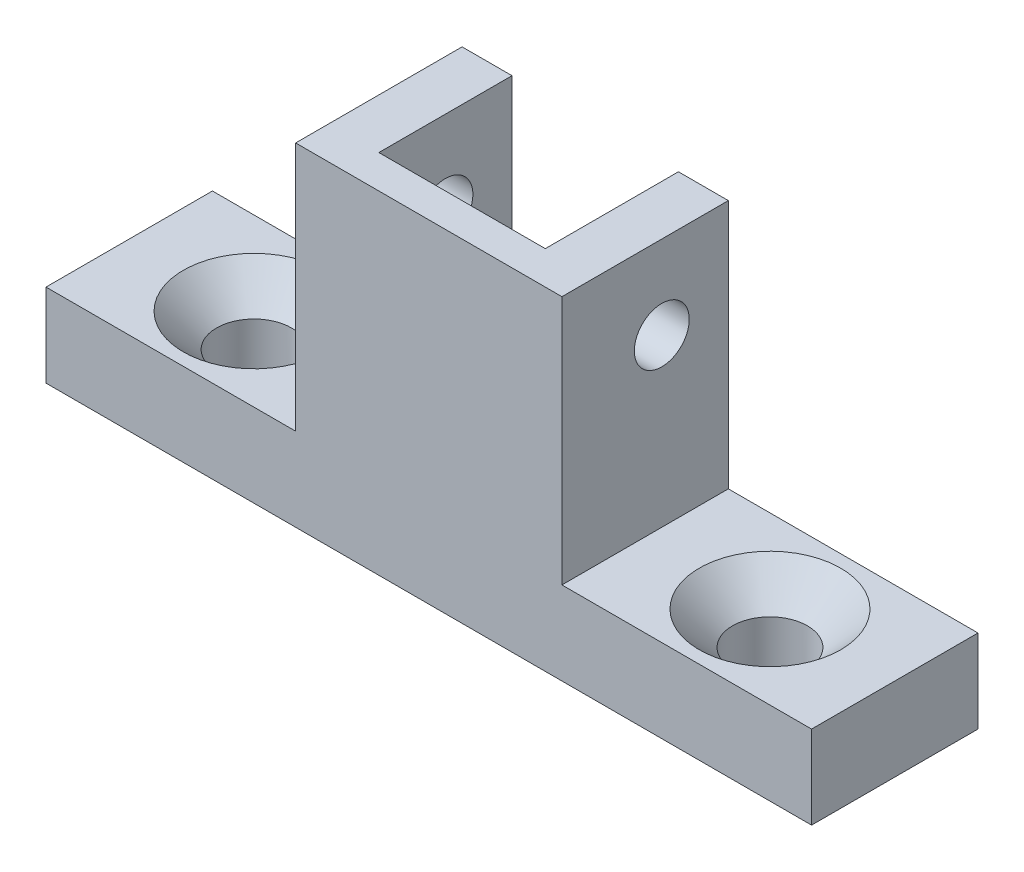
ISO-10303-21;
HEADER;
FILE_DESCRIPTION(('STEP AP214'),'2;1');
FILE_NAME('part.step','',(''),(''),'','','');
FILE_SCHEMA(('AUTOMOTIVE_DESIGN { 1 0 10303 214 1 1 1 1 }'));
ENDSEC;
DATA;
#1=APPLICATION_CONTEXT('core data for automotive mechanical design processes');
#2=APPLICATION_PROTOCOL_DEFINITION('international standard','automotive_design',2000,#1);
#3=PRODUCT_CONTEXT('',#1,'mechanical');
#4=PRODUCT('Part','Part','',(#3));
#5=PRODUCT_RELATED_PRODUCT_CATEGORY('part','',(#4));
#6=PRODUCT_DEFINITION_FORMATION('','',#4);
#7=PRODUCT_DEFINITION_CONTEXT('part definition',#1,'design');
#8=PRODUCT_DEFINITION('design','',#6,#7);
#9=PRODUCT_DEFINITION_SHAPE('','',#8);
#10=(LENGTH_UNIT() NAMED_UNIT(*) SI_UNIT(.MILLI.,.METRE.));
#11=(NAMED_UNIT(*) PLANE_ANGLE_UNIT() SI_UNIT($,.RADIAN.));
#12=(NAMED_UNIT(*) SI_UNIT($,.STERADIAN.) SOLID_ANGLE_UNIT());
#13=UNCERTAINTY_MEASURE_WITH_UNIT(LENGTH_MEASURE(1.E-05),#10,'distance_accuracy_value','');
#14=(GEOMETRIC_REPRESENTATION_CONTEXT(3) GLOBAL_UNCERTAINTY_ASSIGNED_CONTEXT((#13)) GLOBAL_UNIT_ASSIGNED_CONTEXT((#10,
#11,#12)) REPRESENTATION_CONTEXT('',''));
#15=CARTESIAN_POINT('',(0.,0.,0.));
#16=DIRECTION('',(0.,0.,1.));
#17=DIRECTION('',(1.,0.,0.));
#18=AXIS2_PLACEMENT_3D('',#15,#16,#17);
#19=CARTESIAN_POINT('',(23.,-15.,5.));
#20=DIRECTION('',(-1.,0.,0.));
#21=DIRECTION('',(0.,-1.,0.));
#22=AXIS2_PLACEMENT_3D('',#19,#20,#21);
#23=PLANE('',#22);
#24=DIRECTION('',(0.,1.,0.));
#25=VECTOR('',#24,1.);
#26=CARTESIAN_POINT('',(23.,-15.,-5.));
#27=LINE('',#26,#25);
#28=CARTESIAN_POINT('',(23.,-15.,-5.));
#29=VERTEX_POINT('',#28);
#30=CARTESIAN_POINT('',(23.,-10.,-5.));
#31=VERTEX_POINT('',#30);
#32=EDGE_CURVE('E154',#29,#31,#27,.T.);
#33=ORIENTED_EDGE('',*,*,#32,.T.);
#34=DIRECTION('',(0.,0.,-1.));
#35=VECTOR('',#34,1.);
#36=CARTESIAN_POINT('',(23.,-10.,5.));
#37=LINE('',#36,#35);
#38=CARTESIAN_POINT('',(23.,-10.,5.));
#39=VERTEX_POINT('',#38);
#40=EDGE_CURVE('E199',#39,#31,#37,.T.);
#41=ORIENTED_EDGE('',*,*,#40,.F.);
#42=DIRECTION('',(0.,1.,0.));
#43=VECTOR('',#42,1.);
#44=CARTESIAN_POINT('',(23.,-15.,5.));
#45=LINE('',#44,#43);
#46=CARTESIAN_POINT('',(23.,-15.,5.));
#47=VERTEX_POINT('',#46);
#48=EDGE_CURVE('E180',#47,#39,#45,.T.);
#49=ORIENTED_EDGE('',*,*,#48,.F.);
#50=DIRECTION('',(0.,0.,-1.));
#51=VECTOR('',#50,1.);
#52=CARTESIAN_POINT('',(23.,-15.,5.));
#53=LINE('',#52,#51);
#54=EDGE_CURVE('E150',#47,#29,#53,.T.);
#55=ORIENTED_EDGE('',*,*,#54,.T.);
#56=EDGE_LOOP('',(#33,#41,#49,#55));
#57=FACE_BOUND('',#56,.T.);
#58=ADVANCED_FACE('F38',(#57),#23,.F.);
#59=CARTESIAN_POINT('',(23.,-10.,5.));
#60=DIRECTION('',(0.,-1.,0.));
#61=DIRECTION('',(1.,0.,0.));
#62=AXIS2_PLACEMENT_3D('',#59,#60,#61);
#63=PLANE('',#62);
#64=CARTESIAN_POINT('',(15.5,-10.,0.));
#65=DIRECTION('',(0.,-1.,0.));
#66=DIRECTION('',(1.,0.,0.));
#67=AXIS2_PLACEMENT_3D('',#64,#65,#66);
#68=CIRCLE('',#67,4.24999999999999);
#69=CARTESIAN_POINT('',(19.75,-10.,0.));
#70=VERTEX_POINT('',#69);
#71=EDGE_CURVE('E206',#70,#70,#68,.T.);
#72=ORIENTED_EDGE('',*,*,#71,.T.);
#73=EDGE_LOOP('',(#72));
#74=FACE_BOUND('',#73,.T.);
#75=DIRECTION('',(-1.,0.,0.));
#76=VECTOR('',#75,1.);
#77=CARTESIAN_POINT('',(23.,-10.,-5.));
#78=LINE('',#77,#76);
#79=CARTESIAN_POINT('',(8.,-10.,-5.));
#80=VERTEX_POINT('',#79);
#81=EDGE_CURVE('E158',#31,#80,#78,.T.);
#82=ORIENTED_EDGE('',*,*,#81,.T.);
#83=DIRECTION('',(0.,0.,-1.));
#84=VECTOR('',#83,1.);
#85=CARTESIAN_POINT('',(8.,-10.,5.));
#86=LINE('',#85,#84);
#87=CARTESIAN_POINT('',(8.,-10.,5.));
#88=VERTEX_POINT('',#87);
#89=EDGE_CURVE('E195',#88,#80,#86,.T.);
#90=ORIENTED_EDGE('',*,*,#89,.F.);
#91=DIRECTION('',(-1.,0.,0.));
#92=VECTOR('',#91,1.);
#93=CARTESIAN_POINT('',(23.,-10.,5.));
#94=LINE('',#93,#92);
#95=EDGE_CURVE('E106',#39,#88,#94,.T.);
#96=ORIENTED_EDGE('',*,*,#95,.F.);
#97=ORIENTED_EDGE('',*,*,#40,.T.);
#98=EDGE_LOOP('',(#82,#90,#96,#97));
#99=FACE_BOUND('',#98,.T.);
#100=ADVANCED_FACE('F231',(#74,#99),#63,.F.);
#101=CARTESIAN_POINT('',(8.,-10.,5.));
#102=DIRECTION('',(-1.,0.,0.));
#103=DIRECTION('',(0.,-1.,0.));
#104=AXIS2_PLACEMENT_3D('',#101,#102,#103);
#105=PLANE('',#104);
#106=CARTESIAN_POINT('',(8.,0.,-0.999999999999999));
#107=DIRECTION('',(1.,0.,0.));
#108=DIRECTION('',(0.,1.,0.));
#109=AXIS2_PLACEMENT_3D('',#106,#107,#108);
#110=CIRCLE('',#109,1.65);
#111=CARTESIAN_POINT('',(8.,1.65,-0.999999999999999));
#112=VERTEX_POINT('',#111);
#113=EDGE_CURVE('E401',#112,#112,#110,.T.);
#114=ORIENTED_EDGE('',*,*,#113,.F.);
#115=EDGE_LOOP('',(#114));
#116=FACE_BOUND('',#115,.T.);
#117=DIRECTION('',(0.,1.,0.));
#118=VECTOR('',#117,1.);
#119=CARTESIAN_POINT('',(8.,-10.,-5.));
#120=LINE('',#119,#118);
#121=CARTESIAN_POINT('',(8.,5.,-5.));
#122=VERTEX_POINT('',#121);
#123=EDGE_CURVE('E162',#80,#122,#120,.T.);
#124=ORIENTED_EDGE('',*,*,#123,.T.);
#125=DIRECTION('',(0.,0.,-1.));
#126=VECTOR('',#125,1.);
#127=CARTESIAN_POINT('',(8.,5.,5.));
#128=LINE('',#127,#126);
#129=CARTESIAN_POINT('',(8.,5.,5.));
#130=VERTEX_POINT('',#129);
#131=EDGE_CURVE('E191',#130,#122,#128,.T.);
#132=ORIENTED_EDGE('',*,*,#131,.F.);
#133=DIRECTION('',(0.,1.,0.));
#134=VECTOR('',#133,1.);
#135=CARTESIAN_POINT('',(8.,-10.,5.));
#136=LINE('',#135,#134);
#137=EDGE_CURVE('E357',#88,#130,#136,.T.);
#138=ORIENTED_EDGE('',*,*,#137,.F.);
#139=ORIENTED_EDGE('',*,*,#89,.T.);
#140=EDGE_LOOP('',(#124,#132,#138,#139));
#141=FACE_BOUND('',#140,.T.);
#142=ADVANCED_FACE('F238',(#116,#141),#105,.F.);
#143=CARTESIAN_POINT('',(8.,5.,5.));
#144=DIRECTION('',(0.,-1.,0.));
#145=DIRECTION('',(0.,0.,-1.));
#146=AXIS2_PLACEMENT_3D('',#143,#144,#145);
#147=PLANE('',#146);
#148=DIRECTION('',(1.,0.,0.));
#149=VECTOR('',#148,1.);
#150=CARTESIAN_POINT('',(5.,5.,3.));
#151=LINE('',#150,#149);
#152=CARTESIAN_POINT('',(-5.,5.,3.));
#153=VERTEX_POINT('',#152);
#154=CARTESIAN_POINT('',(5.,5.,3.));
#155=VERTEX_POINT('',#154);
#156=EDGE_CURVE('E309',#153,#155,#151,.T.);
#157=ORIENTED_EDGE('',*,*,#156,.F.);
#158=DIRECTION('',(0.,0.,1.));
#159=VECTOR('',#158,1.);
#160=CARTESIAN_POINT('',(-5.,5.,-5.));
#161=LINE('',#160,#159);
#162=CARTESIAN_POINT('',(-5.,5.,-5.));
#163=VERTEX_POINT('',#162);
#164=EDGE_CURVE('E304',#163,#153,#161,.T.);
#165=ORIENTED_EDGE('',*,*,#164,.F.);
#166=DIRECTION('',(-1.,0.,0.));
#167=VECTOR('',#166,1.);
#168=CARTESIAN_POINT('',(8.,5.,-5.));
#169=LINE('',#168,#167);
#170=CARTESIAN_POINT('',(-8.,5.,-5.));
#171=VERTEX_POINT('',#170);
#172=EDGE_CURVE('E165',#163,#171,#169,.T.);
#173=ORIENTED_EDGE('',*,*,#172,.T.);
#174=DIRECTION('',(0.,0.,-1.));
#175=VECTOR('',#174,1.);
#176=CARTESIAN_POINT('',(-8.,5.,5.));
#177=LINE('',#176,#175);
#178=CARTESIAN_POINT('',(-8.,5.,5.));
#179=VERTEX_POINT('',#178);
#180=EDGE_CURVE('E187',#179,#171,#177,.T.);
#181=ORIENTED_EDGE('',*,*,#180,.F.);
#182=DIRECTION('',(-1.,0.,0.));
#183=VECTOR('',#182,1.);
#184=CARTESIAN_POINT('',(8.,5.,5.));
#185=LINE('',#184,#183);
#186=EDGE_CURVE('E360',#130,#179,#185,.T.);
#187=ORIENTED_EDGE('',*,*,#186,.F.);
#188=ORIENTED_EDGE('',*,*,#131,.T.);
#189=CARTESIAN_POINT('',(5.,5.,-5.));
#190=VERTEX_POINT('',#189);
#191=EDGE_CURVE('E166',#122,#190,#169,.T.);
#192=ORIENTED_EDGE('',*,*,#191,.T.);
#193=DIRECTION('',(0.,0.,-1.));
#194=VECTOR('',#193,1.);
#195=CARTESIAN_POINT('',(5.,5.,-5.));
#196=LINE('',#195,#194);
#197=EDGE_CURVE('E55',#155,#190,#196,.T.);
#198=ORIENTED_EDGE('',*,*,#197,.F.);
#199=EDGE_LOOP('',(#157,#165,#173,#181,#187,#188,#192,#198));
#200=FACE_BOUND('',#199,.T.);
#201=ADVANCED_FACE('F244',(#200),#147,.F.);
#202=CARTESIAN_POINT('',(-8.,5.,5.));
#203=DIRECTION('',(1.,0.,0.));
#204=DIRECTION('',(0.,1.,0.));
#205=AXIS2_PLACEMENT_3D('',#202,#203,#204);
#206=PLANE('',#205);
#207=CARTESIAN_POINT('',(-8.,0.,-0.999999999999999));
#208=DIRECTION('',(1.,0.,0.));
#209=DIRECTION('',(0.,1.,0.));
#210=AXIS2_PLACEMENT_3D('',#207,#208,#209);
#211=CIRCLE('',#210,1.65);
#212=CARTESIAN_POINT('',(-8.,1.65,-0.999999999999999));
#213=VERTEX_POINT('',#212);
#214=EDGE_CURVE('E299',#213,#213,#211,.T.);
#215=ORIENTED_EDGE('',*,*,#214,.T.);
#216=EDGE_LOOP('',(#215));
#217=FACE_BOUND('',#216,.T.);
#218=DIRECTION('',(0.,-1.,0.));
#219=VECTOR('',#218,1.);
#220=CARTESIAN_POINT('',(-8.,5.,-5.));
#221=LINE('',#220,#219);
#222=CARTESIAN_POINT('',(-8.,-10.,-5.));
#223=VERTEX_POINT('',#222);
#224=EDGE_CURVE('E170',#171,#223,#221,.T.);
#225=ORIENTED_EDGE('',*,*,#224,.T.);
#226=DIRECTION('',(0.,0.,-1.));
#227=VECTOR('',#226,1.);
#228=CARTESIAN_POINT('',(-8.,-10.,5.));
#229=LINE('',#228,#227);
#230=CARTESIAN_POINT('',(-8.,-10.,5.));
#231=VERTEX_POINT('',#230);
#232=EDGE_CURVE('E143',#231,#223,#229,.T.);
#233=ORIENTED_EDGE('',*,*,#232,.F.);
#234=DIRECTION('',(0.,-1.,0.));
#235=VECTOR('',#234,1.);
#236=CARTESIAN_POINT('',(-8.,5.,5.));
#237=LINE('',#236,#235);
#238=EDGE_CURVE('E129',#179,#231,#237,.T.);
#239=ORIENTED_EDGE('',*,*,#238,.F.);
#240=ORIENTED_EDGE('',*,*,#180,.T.);
#241=EDGE_LOOP('',(#225,#233,#239,#240));
#242=FACE_BOUND('',#241,.T.);
#243=ADVANCED_FACE('F248',(#217,#242),#206,.F.);
#244=CARTESIAN_POINT('',(-8.,-10.,5.));
#245=DIRECTION('',(0.,-1.,0.));
#246=DIRECTION('',(1.,0.,0.));
#247=AXIS2_PLACEMENT_3D('',#244,#245,#246);
#248=PLANE('',#247);
#249=CARTESIAN_POINT('',(-15.5,-10.,0.));
#250=DIRECTION('',(0.,-1.,0.));
#251=DIRECTION('',(1.,0.,0.));
#252=AXIS2_PLACEMENT_3D('',#249,#250,#251);
#253=CIRCLE('',#252,4.25);
#254=CARTESIAN_POINT('',(-11.25,-10.,0.));
#255=VERTEX_POINT('',#254);
#256=EDGE_CURVE('E11',#255,#255,#253,.T.);
#257=ORIENTED_EDGE('',*,*,#256,.T.);
#258=EDGE_LOOP('',(#257));
#259=FACE_BOUND('',#258,.T.);
#260=DIRECTION('',(-1.,0.,0.));
#261=VECTOR('',#260,1.);
#262=CARTESIAN_POINT('',(-8.,-10.,-5.));
#263=LINE('',#262,#261);
#264=CARTESIAN_POINT('',(-23.,-10.,-5.));
#265=VERTEX_POINT('',#264);
#266=EDGE_CURVE('E139',#223,#265,#263,.T.);
#267=ORIENTED_EDGE('',*,*,#266,.T.);
#268=DIRECTION('',(0.,0.,-1.));
#269=VECTOR('',#268,1.);
#270=CARTESIAN_POINT('',(-23.,-10.,5.));
#271=LINE('',#270,#269);
#272=CARTESIAN_POINT('',(-23.,-10.,5.));
#273=VERTEX_POINT('',#272);
#274=EDGE_CURVE('E136',#273,#265,#271,.T.);
#275=ORIENTED_EDGE('',*,*,#274,.F.);
#276=DIRECTION('',(-1.,0.,0.));
#277=VECTOR('',#276,1.);
#278=CARTESIAN_POINT('',(-8.,-10.,5.));
#279=LINE('',#278,#277);
#280=EDGE_CURVE('E122',#231,#273,#279,.T.);
#281=ORIENTED_EDGE('',*,*,#280,.F.);
#282=ORIENTED_EDGE('',*,*,#232,.T.);
#283=EDGE_LOOP('',(#267,#275,#281,#282));
#284=FACE_BOUND('',#283,.T.);
#285=ADVANCED_FACE('F137',(#259,#284),#248,.F.);
#286=CARTESIAN_POINT('',(-23.,-10.,5.));
#287=DIRECTION('',(1.,0.,0.));
#288=DIRECTION('',(0.,1.,0.));
#289=AXIS2_PLACEMENT_3D('',#286,#287,#288);
#290=PLANE('',#289);
#291=DIRECTION('',(0.,-1.,0.));
#292=VECTOR('',#291,1.);
#293=CARTESIAN_POINT('',(-23.,-10.,-5.));
#294=LINE('',#293,#292);
#295=CARTESIAN_POINT('',(-23.,-15.,-5.));
#296=VERTEX_POINT('',#295);
#297=EDGE_CURVE('E175',#265,#296,#294,.T.);
#298=ORIENTED_EDGE('',*,*,#297,.T.);
#299=DIRECTION('',(0.,0.,-1.));
#300=VECTOR('',#299,1.);
#301=CARTESIAN_POINT('',(-23.,-15.,5.));
#302=LINE('',#301,#300);
#303=CARTESIAN_POINT('',(-23.,-15.,5.));
#304=VERTEX_POINT('',#303);
#305=EDGE_CURVE('E144',#304,#296,#302,.T.);
#306=ORIENTED_EDGE('',*,*,#305,.F.);
#307=DIRECTION('',(0.,-1.,0.));
#308=VECTOR('',#307,1.);
#309=CARTESIAN_POINT('',(-23.,-10.,5.));
#310=LINE('',#309,#308);
#311=EDGE_CURVE('E126',#273,#304,#310,.T.);
#312=ORIENTED_EDGE('',*,*,#311,.F.);
#313=ORIENTED_EDGE('',*,*,#274,.T.);
#314=EDGE_LOOP('',(#298,#306,#312,#313));
#315=FACE_BOUND('',#314,.T.);
#316=ADVANCED_FACE('F146',(#315),#290,.F.);
#317=CARTESIAN_POINT('',(-23.,-15.,5.));
#318=DIRECTION('',(0.,1.,0.));
#319=DIRECTION('',(0.,0.,1.));
#320=AXIS2_PLACEMENT_3D('',#317,#318,#319);
#321=PLANE('',#320);
#322=CARTESIAN_POINT('',(-15.5,-15.,0.));
#323=DIRECTION('',(0.,1.,0.));
#324=DIRECTION('',(-1.,0.,0.));
#325=AXIS2_PLACEMENT_3D('',#322,#323,#324);
#326=CIRCLE('',#325,2.25);
#327=CARTESIAN_POINT('',(-17.75,-15.,0.));
#328=VERTEX_POINT('',#327);
#329=EDGE_CURVE('E159',#328,#328,#326,.T.);
#330=ORIENTED_EDGE('',*,*,#329,.T.);
#331=EDGE_LOOP('',(#330));
#332=FACE_BOUND('',#331,.T.);
#333=CARTESIAN_POINT('',(15.5,-15.,0.));
#334=DIRECTION('',(0.,1.,0.));
#335=DIRECTION('',(-1.,0.,0.));
#336=AXIS2_PLACEMENT_3D('',#333,#334,#335);
#337=CIRCLE('',#336,2.25);
#338=CARTESIAN_POINT('',(13.25,-15.,0.));
#339=VERTEX_POINT('',#338);
#340=EDGE_CURVE('E346',#339,#339,#337,.T.);
#341=ORIENTED_EDGE('',*,*,#340,.T.);
#342=EDGE_LOOP('',(#341));
#343=FACE_BOUND('',#342,.T.);
#344=DIRECTION('',(1.,0.,0.));
#345=VECTOR('',#344,1.);
#346=CARTESIAN_POINT('',(-23.,-15.,-5.));
#347=LINE('',#346,#345);
#348=EDGE_CURVE('E97',#296,#29,#347,.T.);
#349=ORIENTED_EDGE('',*,*,#348,.T.);
#350=ORIENTED_EDGE('',*,*,#54,.F.);
#351=DIRECTION('',(1.,0.,0.));
#352=VECTOR('',#351,1.);
#353=CARTESIAN_POINT('',(-23.,-15.,5.));
#354=LINE('',#353,#352);
#355=EDGE_CURVE('E64',#304,#47,#354,.T.);
#356=ORIENTED_EDGE('',*,*,#355,.F.);
#357=ORIENTED_EDGE('',*,*,#305,.T.);
#358=EDGE_LOOP('',(#349,#350,#356,#357));
#359=FACE_BOUND('',#358,.T.);
#360=ADVANCED_FACE('F258',(#332,#343,#359),#321,.F.);
#361=CARTESIAN_POINT('',(0.,0.,5.));
#362=DIRECTION('',(0.,0.,1.));
#363=DIRECTION('',(1.,0.,0.));
#364=AXIS2_PLACEMENT_3D('',#361,#362,#363);
#365=PLANE('',#364);
#366=ORIENTED_EDGE('',*,*,#48,.T.);
#367=ORIENTED_EDGE('',*,*,#95,.T.);
#368=ORIENTED_EDGE('',*,*,#137,.T.);
#369=ORIENTED_EDGE('',*,*,#186,.T.);
#370=ORIENTED_EDGE('',*,*,#238,.T.);
#371=ORIENTED_EDGE('',*,*,#280,.T.);
#372=ORIENTED_EDGE('',*,*,#311,.T.);
#373=ORIENTED_EDGE('',*,*,#355,.T.);
#374=EDGE_LOOP('',(#366,#367,#368,#369,#370,#371,#372,#373));
#375=FACE_BOUND('',#374,.T.);
#376=ADVANCED_FACE('F124',(#375),#365,.T.);
#377=CARTESIAN_POINT('',(0.,0.,-5.));
#378=DIRECTION('',(0.,0.,1.));
#379=DIRECTION('',(1.,0.,0.));
#380=AXIS2_PLACEMENT_3D('',#377,#378,#379);
#381=PLANE('',#380);
#382=ORIENTED_EDGE('',*,*,#172,.F.);
#383=DIRECTION('',(0.,1.,0.));
#384=VECTOR('',#383,1.);
#385=CARTESIAN_POINT('',(-5.,-22.8062484748657,-5.));
#386=LINE('',#385,#384);
#387=CARTESIAN_POINT('',(-5.,-10.,-5.));
#388=VERTEX_POINT('',#387);
#389=EDGE_CURVE('E320',#388,#163,#386,.T.);
#390=ORIENTED_EDGE('',*,*,#389,.F.);
#391=DIRECTION('',(-1.,0.,0.));
#392=VECTOR('',#391,1.);
#393=CARTESIAN_POINT('',(5.,-10.,-5.));
#394=LINE('',#393,#392);
#395=CARTESIAN_POINT('',(5.,-10.,-5.));
#396=VERTEX_POINT('',#395);
#397=EDGE_CURVE('E313',#396,#388,#394,.T.);
#398=ORIENTED_EDGE('',*,*,#397,.F.);
#399=DIRECTION('',(0.,1.,0.));
#400=VECTOR('',#399,1.);
#401=CARTESIAN_POINT('',(5.,-22.8062484748657,-5.));
#402=LINE('',#401,#400);
#403=EDGE_CURVE('E325',#396,#190,#402,.T.);
#404=ORIENTED_EDGE('',*,*,#403,.T.);
#405=ORIENTED_EDGE('',*,*,#191,.F.);
#406=ORIENTED_EDGE('',*,*,#123,.F.);
#407=ORIENTED_EDGE('',*,*,#81,.F.);
#408=ORIENTED_EDGE('',*,*,#32,.F.);
#409=ORIENTED_EDGE('',*,*,#348,.F.);
#410=ORIENTED_EDGE('',*,*,#297,.F.);
#411=ORIENTED_EDGE('',*,*,#266,.F.);
#412=ORIENTED_EDGE('',*,*,#224,.F.);
#413=EDGE_LOOP('',(#382,#390,#398,#404,#405,#406,#407,#408,#409,#410,#411,#412));
#414=FACE_BOUND('',#413,.T.);
#415=ADVANCED_FACE('F262',(#414),#381,.F.);
#416=CARTESIAN_POINT('',(15.5,-15.,0.));
#417=DIRECTION('',(0.,1.,0.));
#418=DIRECTION('',(-1.,0.,0.));
#419=AXIS2_PLACEMENT_3D('',#416,#417,#418);
#420=CYLINDRICAL_SURFACE('',#419,2.25);
#421=CARTESIAN_POINT('',(15.5,-12.,0.));
#422=DIRECTION('',(0.,-1.,0.));
#423=DIRECTION('',(0.,0.,-1.));
#424=AXIS2_PLACEMENT_3D('',#421,#422,#423);
#425=CIRCLE('',#424,2.25);
#426=CARTESIAN_POINT('',(15.5,-12.,-2.25));
#427=VERTEX_POINT('',#426);
#428=EDGE_CURVE('E202',#427,#427,#425,.F.);
#429=ORIENTED_EDGE('',*,*,#428,.T.);
#430=EDGE_LOOP('',(#429));
#431=FACE_BOUND('',#430,.T.);
#432=ORIENTED_EDGE('',*,*,#340,.F.);
#433=EDGE_LOOP('',(#432));
#434=FACE_BOUND('',#433,.T.);
#435=ADVANCED_FACE('F265',(#431,#434),#420,.F.);
#436=CARTESIAN_POINT('',(-15.5,-15.,0.));
#437=DIRECTION('',(0.,1.,0.));
#438=DIRECTION('',(-1.,0.,0.));
#439=AXIS2_PLACEMENT_3D('',#436,#437,#438);
#440=CYLINDRICAL_SURFACE('',#439,2.25);
#441=CARTESIAN_POINT('',(-15.5,-12.,0.));
#442=DIRECTION('',(0.,-1.,0.));
#443=DIRECTION('',(0.,0.,-1.));
#444=AXIS2_PLACEMENT_3D('',#441,#442,#443);
#445=CIRCLE('',#444,2.25);
#446=CARTESIAN_POINT('',(-15.5,-12.,-2.25));
#447=VERTEX_POINT('',#446);
#448=EDGE_CURVE('E48',#447,#447,#445,.F.);
#449=ORIENTED_EDGE('',*,*,#448,.T.);
#450=EDGE_LOOP('',(#449));
#451=FACE_BOUND('',#450,.T.);
#452=ORIENTED_EDGE('',*,*,#329,.F.);
#453=EDGE_LOOP('',(#452));
#454=FACE_BOUND('',#453,.T.);
#455=ADVANCED_FACE('F214',(#451,#454),#440,.F.);
#456=CARTESIAN_POINT('',(15.5,-12.,0.));
#457=DIRECTION('',(0.,1.,0.));
#458=DIRECTION('',(0.,0.,1.));
#459=AXIS2_PLACEMENT_3D('',#456,#457,#458);
#460=CONICAL_SURFACE('',#459,2.25,0.78539816339745);
#461=ORIENTED_EDGE('',*,*,#71,.F.);
#462=EDGE_LOOP('',(#461));
#463=FACE_BOUND('',#462,.T.);
#464=ORIENTED_EDGE('',*,*,#428,.F.);
#465=EDGE_LOOP('',(#464));
#466=FACE_BOUND('',#465,.T.);
#467=ADVANCED_FACE('F219',(#463,#466),#460,.F.);
#468=CARTESIAN_POINT('',(-15.5,-12.,0.));
#469=DIRECTION('',(0.,1.,0.));
#470=DIRECTION('',(0.,0.,1.));
#471=AXIS2_PLACEMENT_3D('',#468,#469,#470);
#472=CONICAL_SURFACE('',#471,2.25,0.78539816339745);
#473=ORIENTED_EDGE('',*,*,#256,.F.);
#474=EDGE_LOOP('',(#473));
#475=FACE_BOUND('',#474,.T.);
#476=ORIENTED_EDGE('',*,*,#448,.F.);
#477=EDGE_LOOP('',(#476));
#478=FACE_BOUND('',#477,.T.);
#479=ADVANCED_FACE('F40',(#475,#478),#472,.F.);
#480=CARTESIAN_POINT('',(-8.,-10.,5.));
#481=DIRECTION('',(0.,-1.,0.));
#482=DIRECTION('',(1.,0.,0.));
#483=AXIS2_PLACEMENT_3D('',#480,#481,#482);
#484=PLANE('',#483);
#485=DIRECTION('',(0.,0.,-1.));
#486=VECTOR('',#485,1.);
#487=CARTESIAN_POINT('',(5.,-10.,-5.));
#488=LINE('',#487,#486);
#489=CARTESIAN_POINT('',(5.,-10.,3.));
#490=VERTEX_POINT('',#489);
#491=EDGE_CURVE('E321',#490,#396,#488,.T.);
#492=ORIENTED_EDGE('',*,*,#491,.T.);
#493=ORIENTED_EDGE('',*,*,#397,.T.);
#494=DIRECTION('',(0.,0.,1.));
#495=VECTOR('',#494,1.);
#496=CARTESIAN_POINT('',(-5.,-10.,-5.));
#497=LINE('',#496,#495);
#498=CARTESIAN_POINT('',(-5.,-10.,3.));
#499=VERTEX_POINT('',#498);
#500=EDGE_CURVE('E332',#388,#499,#497,.T.);
#501=ORIENTED_EDGE('',*,*,#500,.T.);
#502=DIRECTION('',(1.,0.,0.));
#503=VECTOR('',#502,1.);
#504=CARTESIAN_POINT('',(5.,-10.,3.));
#505=LINE('',#504,#503);
#506=EDGE_CURVE('E327',#499,#490,#505,.T.);
#507=ORIENTED_EDGE('',*,*,#506,.T.);
#508=EDGE_LOOP('',(#492,#493,#501,#507));
#509=FACE_BOUND('',#508,.T.);
#510=ADVANCED_FACE('F218',(#509),#484,.F.);
#511=CARTESIAN_POINT('',(-5.,-22.8062484748657,-5.));
#512=DIRECTION('',(-1.,0.,0.));
#513=DIRECTION('',(0.,0.,1.));
#514=AXIS2_PLACEMENT_3D('',#511,#512,#513);
#515=PLANE('',#514);
#516=CARTESIAN_POINT('',(-5.,0.,-0.999999999999999));
#517=DIRECTION('',(-1.,0.,0.));
#518=DIRECTION('',(0.,0.,1.));
#519=AXIS2_PLACEMENT_3D('',#516,#517,#518);
#520=CIRCLE('',#519,1.65);
#521=CARTESIAN_POINT('',(-5.,0.,0.650000000000001));
#522=VERTEX_POINT('',#521);
#523=EDGE_CURVE('E296',#522,#522,#520,.T.);
#524=ORIENTED_EDGE('',*,*,#523,.T.);
#525=EDGE_LOOP('',(#524));
#526=FACE_BOUND('',#525,.T.);
#527=ORIENTED_EDGE('',*,*,#389,.T.);
#528=ORIENTED_EDGE('',*,*,#164,.T.);
#529=DIRECTION('',(0.,1.,0.));
#530=VECTOR('',#529,1.);
#531=CARTESIAN_POINT('',(-5.,-22.8062484748657,3.));
#532=LINE('',#531,#530);
#533=EDGE_CURVE('E331',#499,#153,#532,.T.);
#534=ORIENTED_EDGE('',*,*,#533,.F.);
#535=ORIENTED_EDGE('',*,*,#500,.F.);
#536=EDGE_LOOP('',(#527,#528,#534,#535));
#537=FACE_BOUND('',#536,.T.);
#538=ADVANCED_FACE('F225',(#526,#537),#515,.F.);
#539=CARTESIAN_POINT('',(5.,-22.8062484748657,3.));
#540=DIRECTION('',(0.,0.,1.));
#541=DIRECTION('',(1.,0.,0.));
#542=AXIS2_PLACEMENT_3D('',#539,#540,#541);
#543=PLANE('',#542);
#544=ORIENTED_EDGE('',*,*,#533,.T.);
#545=ORIENTED_EDGE('',*,*,#156,.T.);
#546=DIRECTION('',(0.,1.,0.));
#547=VECTOR('',#546,1.);
#548=CARTESIAN_POINT('',(5.,-22.8062484748657,3.));
#549=LINE('',#548,#547);
#550=EDGE_CURVE('E326',#490,#155,#549,.T.);
#551=ORIENTED_EDGE('',*,*,#550,.F.);
#552=ORIENTED_EDGE('',*,*,#506,.F.);
#553=EDGE_LOOP('',(#544,#545,#551,#552));
#554=FACE_BOUND('',#553,.T.);
#555=ADVANCED_FACE('F276',(#554),#543,.F.);
#556=CARTESIAN_POINT('',(5.,-22.8062484748657,-5.));
#557=DIRECTION('',(1.,0.,0.));
#558=DIRECTION('',(0.,0.,-1.));
#559=AXIS2_PLACEMENT_3D('',#556,#557,#558);
#560=PLANE('',#559);
#561=CARTESIAN_POINT('',(5.,0.,-0.999999999999999));
#562=DIRECTION('',(1.,0.,0.));
#563=DIRECTION('',(0.,0.,-1.));
#564=AXIS2_PLACEMENT_3D('',#561,#562,#563);
#565=CIRCLE('',#564,1.65);
#566=CARTESIAN_POINT('',(5.,0.,-2.65));
#567=VERTEX_POINT('',#566);
#568=EDGE_CURVE('E42',#567,#567,#565,.T.);
#569=ORIENTED_EDGE('',*,*,#568,.T.);
#570=EDGE_LOOP('',(#569));
#571=FACE_BOUND('',#570,.T.);
#572=ORIENTED_EDGE('',*,*,#550,.T.);
#573=ORIENTED_EDGE('',*,*,#197,.T.);
#574=ORIENTED_EDGE('',*,*,#403,.F.);
#575=ORIENTED_EDGE('',*,*,#491,.F.);
#576=EDGE_LOOP('',(#572,#573,#574,#575));
#577=FACE_BOUND('',#576,.T.);
#578=ADVANCED_FACE('F280',(#571,#577),#560,.F.);
#579=CARTESIAN_POINT('',(-23.,0.,-0.999999999999999));
#580=DIRECTION('',(1.,0.,0.));
#581=DIRECTION('',(0.,1.,0.));
#582=AXIS2_PLACEMENT_3D('',#579,#580,#581);
#583=CYLINDRICAL_SURFACE('',#582,1.65);
#584=ORIENTED_EDGE('',*,*,#113,.T.);
#585=EDGE_LOOP('',(#584));
#586=FACE_BOUND('',#585,.T.);
#587=ORIENTED_EDGE('',*,*,#568,.F.);
#588=EDGE_LOOP('',(#587));
#589=FACE_BOUND('',#588,.T.);
#590=ADVANCED_FACE('F284',(#586,#589),#583,.F.);
#591=ORIENTED_EDGE('',*,*,#523,.F.);
#592=EDGE_LOOP('',(#591));
#593=FACE_BOUND('',#592,.T.);
#594=ORIENTED_EDGE('',*,*,#214,.F.);
#595=EDGE_LOOP('',(#594));
#596=FACE_BOUND('',#595,.T.);
#597=ADVANCED_FACE('F286',(#593,#596),#583,.F.);
#598=CLOSED_SHELL('',(#58,#100,#142,#201,#243,#285,#316,#360,#376,#415,#435,#455,#467,#479,#510,
#538,#555,#578,#590,#597));
#599=MANIFOLD_SOLID_BREP('B2',#598);
#600=ADVANCED_BREP_SHAPE_REPRESENTATION('',(#18,#599),#14);
#601=SHAPE_DEFINITION_REPRESENTATION(#9,#600);
ENDSEC;
END-ISO-10303-21;
